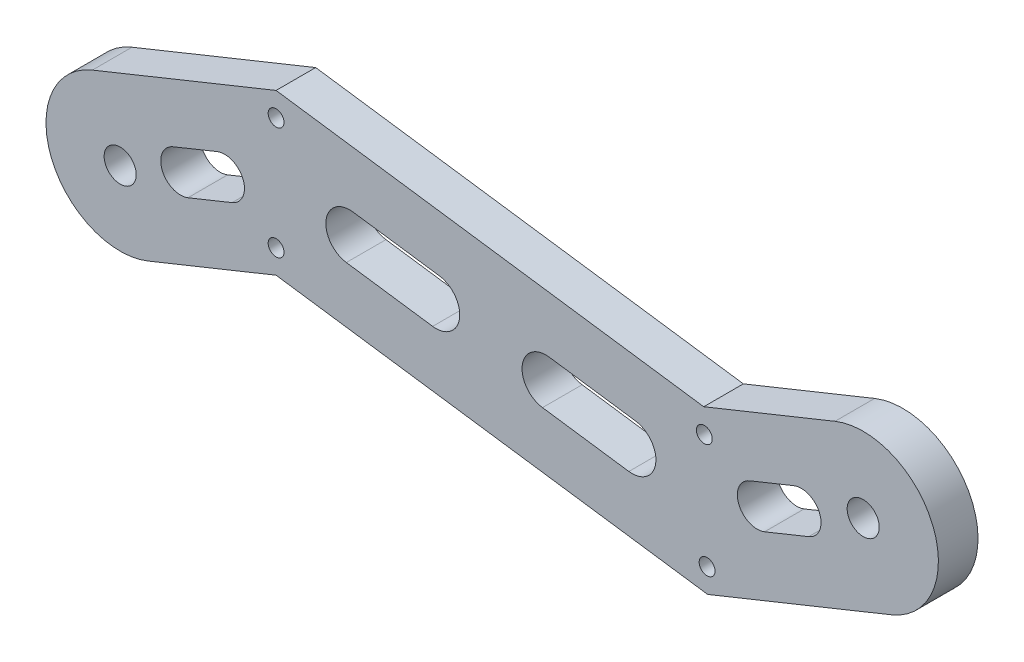
ISO-10303-21;
HEADER;
FILE_DESCRIPTION(('STEP AP214'),'2;1');
FILE_NAME('part.step','',(''),(''),'','','');
FILE_SCHEMA(('AUTOMOTIVE_DESIGN { 1 0 10303 214 1 1 1 1 }'));
ENDSEC;
DATA;
#1=APPLICATION_CONTEXT('core data for automotive mechanical design processes');
#2=APPLICATION_PROTOCOL_DEFINITION('international standard','automotive_design',2000,#1);
#3=PRODUCT_CONTEXT('',#1,'mechanical');
#4=PRODUCT('Part','Part','',(#3));
#5=PRODUCT_RELATED_PRODUCT_CATEGORY('part','',(#4));
#6=PRODUCT_DEFINITION_FORMATION('','',#4);
#7=PRODUCT_DEFINITION_CONTEXT('part definition',#1,'design');
#8=PRODUCT_DEFINITION('design','',#6,#7);
#9=PRODUCT_DEFINITION_SHAPE('','',#8);
#10=(LENGTH_UNIT() NAMED_UNIT(*) SI_UNIT(.MILLI.,.METRE.));
#11=(NAMED_UNIT(*) PLANE_ANGLE_UNIT() SI_UNIT($,.RADIAN.));
#12=(NAMED_UNIT(*) SI_UNIT($,.STERADIAN.) SOLID_ANGLE_UNIT());
#13=UNCERTAINTY_MEASURE_WITH_UNIT(LENGTH_MEASURE(1.E-05),#10,'distance_accuracy_value','');
#14=(GEOMETRIC_REPRESENTATION_CONTEXT(3) GLOBAL_UNCERTAINTY_ASSIGNED_CONTEXT((#13)) GLOBAL_UNIT_ASSIGNED_CONTEXT((#10,
#11,#12)) REPRESENTATION_CONTEXT('',''));
#15=CARTESIAN_POINT('',(0.,0.,0.));
#16=DIRECTION('',(0.,0.,1.));
#17=DIRECTION('',(1.,0.,0.));
#18=AXIS2_PLACEMENT_3D('',#15,#16,#17);
#19=CARTESIAN_POINT('',(-91.8699436205663,2.980916678925,10.));
#20=DIRECTION('',(0.,0.,1.));
#21=DIRECTION('',(1.,0.,0.));
#22=AXIS2_PLACEMENT_3D('',#19,#20,#21);
#23=PLANE('',#22);
#24=DIRECTION('',(0.927183854566787,0.374606593415913,0.));
#25=VECTOR('',#24,1.);
#26=CARTESIAN_POINT('',(70.7597122956534,4.2465525505887,10.));
#27=LINE('',#26,#25);
#28=CARTESIAN_POINT('',(70.7597122956534,4.2465525505887,10.));
#29=VERTEX_POINT('',#28);
#30=CARTESIAN_POINT('',(81.8859185504549,8.74183167157967,10.));
#31=VERTEX_POINT('',#30);
#32=EDGE_CURVE('E269',#29,#31,#27,.T.);
#33=ORIENTED_EDGE('',*,*,#32,.F.);
#34=CARTESIAN_POINT('',(68.8866793285738,8.88247182342264,10.));
#35=DIRECTION('',(0.,0.,1.));
#36=DIRECTION('',(1.,0.,0.));
#37=AXIS2_PLACEMENT_3D('',#34,#35,#36);
#38=CIRCLE('',#37,5.);
#39=CARTESIAN_POINT('',(67.0136463614943,13.5183910962566,10.));
#40=VERTEX_POINT('',#39);
#41=EDGE_CURVE('E267',#40,#29,#38,.T.);
#42=ORIENTED_EDGE('',*,*,#41,.F.);
#43=DIRECTION('',(-0.927183854566787,-0.374606593415913,0.));
#44=VECTOR('',#43,1.);
#45=CARTESIAN_POINT('',(67.0136463614943,13.5183910962566,10.));
#46=LINE('',#45,#44);
#47=CARTESIAN_POINT('',(78.1398526162957,18.0136702172475,10.));
#48=VERTEX_POINT('',#47);
#49=EDGE_CURVE('E275',#48,#40,#46,.T.);
#50=ORIENTED_EDGE('',*,*,#49,.F.);
#51=CARTESIAN_POINT('',(80.0128855833753,13.3777509444136,10.));
#52=DIRECTION('',(0.,0.,1.));
#53=DIRECTION('',(1.,0.,0.));
#54=AXIS2_PLACEMENT_3D('',#51,#52,#53);
#55=CIRCLE('',#54,5.);
#56=EDGE_CURVE('E272',#31,#48,#55,.T.);
#57=ORIENTED_EDGE('',*,*,#56,.F.);
#58=EDGE_LOOP('',(#33,#42,#50,#57));
#59=FACE_BOUND('',#58,.T.);
#60=DIRECTION('',(0.927183854566787,0.374606593415913,0.));
#61=VECTOR('',#60,1.);
#62=CARTESIAN_POINT('',(-74.7593499035873,4.50137156680685,10.));
#63=LINE('',#62,#61);
#64=CARTESIAN_POINT('',(-74.7593499035873,4.50137156680685,10.));
#65=VERTEX_POINT('',#64);
#66=CARTESIAN_POINT('',(-63.6331436487858,8.99665068779783,10.));
#67=VERTEX_POINT('',#66);
#68=EDGE_CURVE('E300',#65,#67,#63,.T.);
#69=ORIENTED_EDGE('',*,*,#68,.F.);
#70=CARTESIAN_POINT('',(-76.6323828706669,9.1372908396408,10.));
#71=DIRECTION('',(0.,0.,1.));
#72=DIRECTION('',(1.,0.,0.));
#73=AXIS2_PLACEMENT_3D('',#70,#71,#72);
#74=CIRCLE('',#73,5.);
#75=CARTESIAN_POINT('',(-78.5054158377464,13.7732101124747,10.));
#76=VERTEX_POINT('',#75);
#77=EDGE_CURVE('E298',#76,#65,#74,.T.);
#78=ORIENTED_EDGE('',*,*,#77,.F.);
#79=DIRECTION('',(-0.927183854566787,-0.374606593415913,0.));
#80=VECTOR('',#79,1.);
#81=CARTESIAN_POINT('',(-78.5054158377464,13.7732101124747,10.));
#82=LINE('',#81,#80);
#83=CARTESIAN_POINT('',(-67.379209582945,18.2684892334657,10.));
#84=VERTEX_POINT('',#83);
#85=EDGE_CURVE('E306',#84,#76,#82,.T.);
#86=ORIENTED_EDGE('',*,*,#85,.F.);
#87=CARTESIAN_POINT('',(-65.5061766158654,13.6325699606318,10.));
#88=DIRECTION('',(0.,0.,1.));
#89=DIRECTION('',(1.,0.,0.));
#90=AXIS2_PLACEMENT_3D('',#87,#88,#89);
#91=CIRCLE('',#90,5.);
#92=EDGE_CURVE('E303',#67,#84,#91,.T.);
#93=ORIENTED_EDGE('',*,*,#92,.F.);
#94=EDGE_LOOP('',(#69,#78,#86,#93));
#95=FACE_BOUND('',#94,.T.);
#96=CARTESIAN_POINT('',(-52.5256026519304,4.68051081808217,10.));
#97=DIRECTION('',(0.,0.,1.));
#98=DIRECTION('',(1.,0.,0.));
#99=AXIS2_PLACEMENT_3D('',#96,#97,#98);
#100=CIRCLE('',#99,2.);
#101=CARTESIAN_POINT('',(-50.5256026519304,4.68051081808217,10.));
#102=VERTEX_POINT('',#101);
#103=EDGE_CURVE('E329',#102,#102,#100,.T.);
#104=ORIENTED_EDGE('',*,*,#103,.F.);
#105=EDGE_LOOP('',(#104));
#106=FACE_BOUND('',#105,.T.);
#107=CARTESIAN_POINT('',(-52.5256026519304,33.0736137188269,10.));
#108=DIRECTION('',(0.,0.,1.));
#109=DIRECTION('',(1.,0.,0.));
#110=AXIS2_PLACEMENT_3D('',#107,#108,#109);
#111=CIRCLE('',#110,2.);
#112=CARTESIAN_POINT('',(-50.5256026519304,33.0736137188269,10.));
#113=VERTEX_POINT('',#112);
#114=EDGE_CURVE('E341',#113,#113,#111,.T.);
#115=ORIENTED_EDGE('',*,*,#114,.F.);
#116=EDGE_LOOP('',(#115));
#117=FACE_BOUND('',#116,.T.);
#118=CARTESIAN_POINT('',(-91.8699436205663,2.980916678925,10.));
#119=DIRECTION('',(0.,0.,1.));
#120=DIRECTION('',(1.,0.,0.));
#121=AXIS2_PLACEMENT_3D('',#118,#119,#120);
#122=CIRCLE('',#121,4.05);
#123=CARTESIAN_POINT('',(-87.8199436205663,2.980916678925,10.));
#124=VERTEX_POINT('',#123);
#125=EDGE_CURVE('E353',#124,#124,#122,.T.);
#126=ORIENTED_EDGE('',*,*,#125,.F.);
#127=EDGE_LOOP('',(#126));
#128=FACE_BOUND('',#127,.T.);
#129=DIRECTION('',(-0.927183854566787,-0.374606593415913,0.));
#130=VECTOR('',#129,1.);
#131=CARTESIAN_POINT('',(-52.5256026519304,39.0736137188269,10.));
#132=LINE('',#131,#130);
#133=CARTESIAN_POINT('',(-52.5256026519304,39.0736137188269,10.));
#134=VERTEX_POINT('',#133);
#135=CARTESIAN_POINT('',(-98.8847953802698,20.3432840480312,10.));
#136=VERTEX_POINT('',#135);
#137=EDGE_CURVE('E359',#134,#136,#132,.T.);
#138=ORIENTED_EDGE('',*,*,#137,.T.);
#139=CARTESIAN_POINT('',(-91.8699436205663,2.980916678925,10.));
#140=DIRECTION('',(0.,0.,1.));
#141=DIRECTION('',(1.,0.,0.));
#142=AXIS2_PLACEMENT_3D('',#139,#140,#141);
#143=CIRCLE('',#142,18.7259164227127);
#144=CARTESIAN_POINT('',(-84.8550918608627,-14.3814506901812,10.));
#145=VERTEX_POINT('',#144);
#146=EDGE_CURVE('E362',#136,#145,#143,.T.);
#147=ORIENTED_EDGE('',*,*,#146,.T.);
#148=DIRECTION('',(0.927183854566787,0.374606593415913,0.));
#149=VECTOR('',#148,1.);
#150=CARTESIAN_POINT('',(-52.5256026519304,-1.31948918191783,10.));
#151=LINE('',#150,#149);
#152=CARTESIAN_POINT('',(-52.5256026519304,-1.31948918191783,10.));
#153=VERTEX_POINT('',#152);
#154=EDGE_CURVE('E365',#145,#153,#151,.T.);
#155=ORIENTED_EDGE('',*,*,#154,.T.);
#156=DIRECTION('',(0.99026806874157,-0.139173100960066,0.));
#157=VECTOR('',#156,1.);
#158=CARTESIAN_POINT('',(-52.5256026519304,-1.31948918191783,10.));
#159=LINE('',#158,#157);
#160=CARTESIAN_POINT('',(56.4038849096423,-16.6285302875251,10.));
#161=VERTEX_POINT('',#160);
#162=EDGE_CURVE('E367',#153,#161,#159,.T.);
#163=ORIENTED_EDGE('',*,*,#162,.T.);
#164=DIRECTION('',(0.927183854566787,0.374606593415913,0.));
#165=VECTOR('',#164,1.);
#166=CARTESIAN_POINT('',(56.4038849096423,-16.6285302875251,10.));
#167=LINE('',#166,#165);
#168=CARTESIAN_POINT('',(102.763077637982,2.10179938327057,10.));
#169=VERTEX_POINT('',#168);
#170=EDGE_CURVE('E369',#161,#169,#167,.T.);
#171=ORIENTED_EDGE('',*,*,#170,.T.);
#172=CARTESIAN_POINT('',(95.6540738473726,19.6972012062936,10.));
#173=DIRECTION('',(0.,0.,1.));
#174=DIRECTION('',(-1.,0.,0.));
#175=AXIS2_PLACEMENT_3D('',#172,#173,#174);
#176=CIRCLE('',#175,18.9772521775028);
#177=CARTESIAN_POINT('',(88.5450700567636,37.2926030293166,10.));
#178=VERTEX_POINT('',#177);
#179=EDGE_CURVE('E371',#169,#178,#176,.T.);
#180=ORIENTED_EDGE('',*,*,#179,.T.);
#181=DIRECTION('',(-0.927183854566787,-0.374606593415913,0.));
#182=VECTOR('',#181,1.);
#183=CARTESIAN_POINT('',(55.4083258196354,23.9044893187248,10.));
#184=LINE('',#183,#182);
#185=CARTESIAN_POINT('',(55.4083258196354,23.9044893187248,10.));
#186=VERTEX_POINT('',#185);
#187=EDGE_CURVE('E373',#178,#186,#184,.T.);
#188=ORIENTED_EDGE('',*,*,#187,.T.);
#189=DIRECTION('',(-0.99026806874157,0.139173100960066,0.));
#190=VECTOR('',#189,1.);
#191=CARTESIAN_POINT('',(-52.5256026519304,39.0736137188269,10.));
#192=LINE('',#191,#190);
#193=EDGE_CURVE('E375',#186,#134,#192,.T.);
#194=ORIENTED_EDGE('',*,*,#193,.T.);
#195=EDGE_LOOP('',(#138,#147,#155,#163,#171,#180,#188,#194));
#196=FACE_BOUND('',#195,.T.);
#197=CARTESIAN_POINT('',(95.6540738473726,19.6972012062936,10.));
#198=DIRECTION('',(0.,0.,1.));
#199=DIRECTION('',(1.,0.,0.));
#200=AXIS2_PLACEMENT_3D('',#197,#198,#199);
#201=CIRCLE('',#200,4.05);
#202=CARTESIAN_POINT('',(99.7040738473727,19.6972012062936,10.));
#203=VERTEX_POINT('',#202);
#204=EDGE_CURVE('E347',#203,#203,#201,.T.);
#205=ORIENTED_EDGE('',*,*,#204,.F.);
#206=EDGE_LOOP('',(#205));
#207=FACE_BOUND('',#206,.T.);
#208=CARTESIAN_POINT('',(55.555695904521,17.9044893187248,10.));
#209=DIRECTION('',(0.,0.,1.));
#210=DIRECTION('',(1.,0.,0.));
#211=AXIS2_PLACEMENT_3D('',#208,#209,#210);
#212=CIRCLE('',#211,2.);
#213=CARTESIAN_POINT('',(57.555695904521,17.9044893187248,10.));
#214=VERTEX_POINT('',#213);
#215=EDGE_CURVE('E335',#214,#214,#212,.T.);
#216=ORIENTED_EDGE('',*,*,#215,.F.);
#217=EDGE_LOOP('',(#216));
#218=FACE_BOUND('',#217,.T.);
#219=CARTESIAN_POINT('',(56.2565148247568,-10.6285302875251,10.));
#220=DIRECTION('',(0.,0.,1.));
#221=DIRECTION('',(1.,0.,0.));
#222=AXIS2_PLACEMENT_3D('',#219,#220,#221);
#223=CIRCLE('',#222,2.);
#224=CARTESIAN_POINT('',(58.2565148247568,-10.6285302875251,10.));
#225=VERTEX_POINT('',#224);
#226=EDGE_CURVE('E261',#225,#225,#223,.T.);
#227=ORIENTED_EDGE('',*,*,#226,.F.);
#228=EDGE_LOOP('',(#227));
#229=FACE_BOUND('',#228,.T.);
#230=DIRECTION('',(0.99026806874157,-0.139173100960066,0.));
#231=VECTOR('',#230,1.);
#232=CARTESIAN_POINT('',(-34.7944377241027,10.3261441141401,10.));
#233=LINE('',#232,#231);
#234=CARTESIAN_POINT('',(-34.7944377241027,10.3261441141401,10.));
#235=VERTEX_POINT('',#234);
#236=CARTESIAN_POINT('',(-13.0085402117882,7.2643358930187,10.));
#237=VERTEX_POINT('',#236);
#238=EDGE_CURVE('E232',#235,#237,#233,.T.);
#239=ORIENTED_EDGE('',*,*,#238,.F.);
#240=CARTESIAN_POINT('',(-33.9593991183423,16.2677525265896,10.));
#241=DIRECTION('',(0.,0.,1.));
#242=DIRECTION('',(1.,0.,0.));
#243=AXIS2_PLACEMENT_3D('',#240,#241,#242);
#244=CIRCLE('',#243,6.);
#245=CARTESIAN_POINT('',(-33.1243605125819,22.209360939039,10.));
#246=VERTEX_POINT('',#245);
#247=EDGE_CURVE('E230',#246,#235,#244,.T.);
#248=ORIENTED_EDGE('',*,*,#247,.F.);
#249=DIRECTION('',(-0.99026806874157,0.139173100960065,0.));
#250=VECTOR('',#249,1.);
#251=CARTESIAN_POINT('',(-33.1243605125819,22.209360939039,10.));
#252=LINE('',#251,#250);
#253=CARTESIAN_POINT('',(-11.3384630002674,19.1475527179175,10.));
#254=VERTEX_POINT('',#253);
#255=EDGE_CURVE('E238',#254,#246,#252,.T.);
#256=ORIENTED_EDGE('',*,*,#255,.F.);
#257=CARTESIAN_POINT('',(-12.1735016060278,13.2059443054681,10.));
#258=DIRECTION('',(0.,0.,1.));
#259=DIRECTION('',(1.,0.,0.));
#260=AXIS2_PLACEMENT_3D('',#257,#258,#259);
#261=CIRCLE('',#260,6.);
#262=EDGE_CURVE('E235',#237,#254,#261,.T.);
#263=ORIENTED_EDGE('',*,*,#262,.F.);
#264=EDGE_LOOP('',(#239,#248,#256,#263));
#265=FACE_BOUND('',#264,.T.);
#266=DIRECTION('',(0.99026806874157,-0.139173100960066,0.));
#267=VECTOR('',#266,1.);
#268=CARTESIAN_POINT('',(14.7189657129758,3.36748906613686,10.));
#269=LINE('',#268,#267);
#270=CARTESIAN_POINT('',(14.7189657129758,3.36748906613686,10.));
#271=VERTEX_POINT('',#270);
#272=CARTESIAN_POINT('',(36.5048632252904,0.305680845015419,10.));
#273=VERTEX_POINT('',#272);
#274=EDGE_CURVE('E202',#271,#273,#269,.T.);
#275=ORIENTED_EDGE('',*,*,#274,.F.);
#276=CARTESIAN_POINT('',(15.5540043187362,9.30909747858628,10.));
#277=DIRECTION('',(0.,0.,1.));
#278=DIRECTION('',(1.,0.,0.));
#279=AXIS2_PLACEMENT_3D('',#276,#277,#278);
#280=CIRCLE('',#279,6.);
#281=CARTESIAN_POINT('',(16.3890429244966,15.2507058910357,10.));
#282=VERTEX_POINT('',#281);
#283=EDGE_CURVE('E194',#282,#271,#280,.T.);
#284=ORIENTED_EDGE('',*,*,#283,.F.);
#285=DIRECTION('',(-0.99026806874157,0.139173100960066,0.));
#286=VECTOR('',#285,1.);
#287=CARTESIAN_POINT('',(16.3890429244966,15.2507058910357,10.));
#288=LINE('',#287,#286);
#289=CARTESIAN_POINT('',(38.1749404368111,12.1888976699143,10.));
#290=VERTEX_POINT('',#289);
#291=EDGE_CURVE('E216',#290,#282,#288,.T.);
#292=ORIENTED_EDGE('',*,*,#291,.F.);
#293=CARTESIAN_POINT('',(37.3399018310508,6.24728925746484,10.));
#294=DIRECTION('',(0.,0.,1.));
#295=DIRECTION('',(1.,0.,0.));
#296=AXIS2_PLACEMENT_3D('',#293,#294,#295);
#297=CIRCLE('',#296,6.);
#298=EDGE_CURVE('E214',#273,#290,#297,.T.);
#299=ORIENTED_EDGE('',*,*,#298,.F.);
#300=EDGE_LOOP('',(#275,#284,#292,#299));
#301=FACE_BOUND('',#300,.T.);
#302=ADVANCED_FACE('F33',(#59,#95,#106,#117,#128,#196,#207,#218,#229,#265,#301),#23,.T.);
#303=CARTESIAN_POINT('',(-91.8699436205663,2.980916678925,0.));
#304=DIRECTION('',(0.,0.,1.));
#305=DIRECTION('',(1.,0.,0.));
#306=AXIS2_PLACEMENT_3D('',#303,#304,#305);
#307=PLANE('',#306);
#308=CARTESIAN_POINT('',(-33.9593991183423,16.2677525265896,0.));
#309=DIRECTION('',(0.,0.,1.));
#310=DIRECTION('',(1.,0.,0.));
#311=AXIS2_PLACEMENT_3D('',#308,#309,#310);
#312=CIRCLE('',#311,6.);
#313=CARTESIAN_POINT('',(-33.1243605125819,22.209360939039,0.));
#314=VERTEX_POINT('',#313);
#315=CARTESIAN_POINT('',(-34.7944377241027,10.3261441141401,0.));
#316=VERTEX_POINT('',#315);
#317=EDGE_CURVE('E210',#314,#316,#312,.T.);
#318=ORIENTED_EDGE('',*,*,#317,.T.);
#319=DIRECTION('',(0.99026806874157,-0.139173100960066,0.));
#320=VECTOR('',#319,1.);
#321=CARTESIAN_POINT('',(-34.7944377241027,10.3261441141401,0.));
#322=LINE('',#321,#320);
#323=CARTESIAN_POINT('',(-13.0085402117882,7.2643358930187,0.));
#324=VERTEX_POINT('',#323);
#325=EDGE_CURVE('E243',#316,#324,#322,.T.);
#326=ORIENTED_EDGE('',*,*,#325,.T.);
#327=CARTESIAN_POINT('',(-12.1735016060278,13.2059443054681,0.));
#328=DIRECTION('',(0.,0.,1.));
#329=DIRECTION('',(1.,0.,0.));
#330=AXIS2_PLACEMENT_3D('',#327,#328,#329);
#331=CIRCLE('',#330,6.);
#332=CARTESIAN_POINT('',(-11.3384630002674,19.1475527179175,0.));
#333=VERTEX_POINT('',#332);
#334=EDGE_CURVE('E246',#324,#333,#331,.T.);
#335=ORIENTED_EDGE('',*,*,#334,.T.);
#336=DIRECTION('',(-0.99026806874157,0.139173100960065,0.));
#337=VECTOR('',#336,1.);
#338=CARTESIAN_POINT('',(-33.1243605125819,22.209360939039,0.));
#339=LINE('',#338,#337);
#340=EDGE_CURVE('E233',#333,#314,#339,.T.);
#341=ORIENTED_EDGE('',*,*,#340,.T.);
#342=EDGE_LOOP('',(#318,#326,#335,#341));
#343=FACE_BOUND('',#342,.T.);
#344=CARTESIAN_POINT('',(-76.6323828706669,9.1372908396408,0.));
#345=DIRECTION('',(0.,0.,1.));
#346=DIRECTION('',(1.,0.,0.));
#347=AXIS2_PLACEMENT_3D('',#344,#345,#346);
#348=CIRCLE('',#347,5.);
#349=CARTESIAN_POINT('',(-78.5054158377464,13.7732101124747,0.));
#350=VERTEX_POINT('',#349);
#351=CARTESIAN_POINT('',(-74.7593499035873,4.50137156680685,0.));
#352=VERTEX_POINT('',#351);
#353=EDGE_CURVE('E297',#350,#352,#348,.T.);
#354=ORIENTED_EDGE('',*,*,#353,.T.);
#355=DIRECTION('',(0.927183854566787,0.374606593415913,0.));
#356=VECTOR('',#355,1.);
#357=CARTESIAN_POINT('',(-74.7593499035873,4.50137156680685,0.));
#358=LINE('',#357,#356);
#359=CARTESIAN_POINT('',(-63.6331436487858,8.99665068779783,0.));
#360=VERTEX_POINT('',#359);
#361=EDGE_CURVE('E311',#352,#360,#358,.T.);
#362=ORIENTED_EDGE('',*,*,#361,.T.);
#363=CARTESIAN_POINT('',(-65.5061766158654,13.6325699606318,0.));
#364=DIRECTION('',(0.,0.,1.));
#365=DIRECTION('',(1.,0.,0.));
#366=AXIS2_PLACEMENT_3D('',#363,#364,#365);
#367=CIRCLE('',#366,5.);
#368=CARTESIAN_POINT('',(-67.379209582945,18.2684892334657,0.));
#369=VERTEX_POINT('',#368);
#370=EDGE_CURVE('E314',#360,#369,#367,.T.);
#371=ORIENTED_EDGE('',*,*,#370,.T.);
#372=DIRECTION('',(-0.927183854566787,-0.374606593415913,0.));
#373=VECTOR('',#372,1.);
#374=CARTESIAN_POINT('',(-78.5054158377464,13.7732101124747,0.));
#375=LINE('',#374,#373);
#376=EDGE_CURVE('E301',#369,#350,#375,.T.);
#377=ORIENTED_EDGE('',*,*,#376,.T.);
#378=EDGE_LOOP('',(#354,#362,#371,#377));
#379=FACE_BOUND('',#378,.T.);
#380=DIRECTION('',(-0.927183854566787,-0.374606593415913,0.));
#381=VECTOR('',#380,1.);
#382=CARTESIAN_POINT('',(-52.5256026519304,39.0736137188269,0.));
#383=LINE('',#382,#381);
#384=CARTESIAN_POINT('',(-52.5256026519304,39.0736137188269,0.));
#385=VERTEX_POINT('',#384);
#386=CARTESIAN_POINT('',(-98.8847953802698,20.3432840480312,0.));
#387=VERTEX_POINT('',#386);
#388=EDGE_CURVE('E356',#385,#387,#383,.T.);
#389=ORIENTED_EDGE('',*,*,#388,.F.);
#390=DIRECTION('',(-0.99026806874157,0.139173100960066,0.));
#391=VECTOR('',#390,1.);
#392=CARTESIAN_POINT('',(-52.5256026519304,39.0736137188269,0.));
#393=LINE('',#392,#391);
#394=CARTESIAN_POINT('',(55.4083258196354,23.9044893187248,0.));
#395=VERTEX_POINT('',#394);
#396=EDGE_CURVE('E363',#395,#385,#393,.T.);
#397=ORIENTED_EDGE('',*,*,#396,.F.);
#398=DIRECTION('',(-0.927183854566787,-0.374606593415913,0.));
#399=VECTOR('',#398,1.);
#400=CARTESIAN_POINT('',(55.4083258196354,23.9044893187248,0.));
#401=LINE('',#400,#399);
#402=CARTESIAN_POINT('',(88.5450700567636,37.2926030293166,0.));
#403=VERTEX_POINT('',#402);
#404=EDGE_CURVE('E390',#403,#395,#401,.T.);
#405=ORIENTED_EDGE('',*,*,#404,.F.);
#406=CARTESIAN_POINT('',(95.6540738473726,19.6972012062936,0.));
#407=DIRECTION('',(0.,0.,1.));
#408=DIRECTION('',(-1.,0.,0.));
#409=AXIS2_PLACEMENT_3D('',#406,#407,#408);
#410=CIRCLE('',#409,18.9772521775028);
#411=CARTESIAN_POINT('',(102.763077637982,2.10179938327057,0.));
#412=VERTEX_POINT('',#411);
#413=EDGE_CURVE('E388',#412,#403,#410,.T.);
#414=ORIENTED_EDGE('',*,*,#413,.F.);
#415=DIRECTION('',(0.927183854566787,0.374606593415913,0.));
#416=VECTOR('',#415,1.);
#417=CARTESIAN_POINT('',(56.4038849096423,-16.6285302875251,0.));
#418=LINE('',#417,#416);
#419=CARTESIAN_POINT('',(56.4038849096423,-16.6285302875251,0.));
#420=VERTEX_POINT('',#419);
#421=EDGE_CURVE('E386',#420,#412,#418,.T.);
#422=ORIENTED_EDGE('',*,*,#421,.F.);
#423=DIRECTION('',(0.99026806874157,-0.139173100960066,0.));
#424=VECTOR('',#423,1.);
#425=CARTESIAN_POINT('',(-52.5256026519304,-1.31948918191783,0.));
#426=LINE('',#425,#424);
#427=CARTESIAN_POINT('',(-52.5256026519304,-1.31948918191783,0.));
#428=VERTEX_POINT('',#427);
#429=EDGE_CURVE('E384',#428,#420,#426,.T.);
#430=ORIENTED_EDGE('',*,*,#429,.F.);
#431=DIRECTION('',(0.927183854566787,0.374606593415913,0.));
#432=VECTOR('',#431,1.);
#433=CARTESIAN_POINT('',(-52.5256026519304,-1.31948918191783,0.));
#434=LINE('',#433,#432);
#435=CARTESIAN_POINT('',(-84.8550918608627,-14.3814506901812,0.));
#436=VERTEX_POINT('',#435);
#437=EDGE_CURVE('E382',#436,#428,#434,.T.);
#438=ORIENTED_EDGE('',*,*,#437,.F.);
#439=CARTESIAN_POINT('',(-91.8699436205663,2.980916678925,0.));
#440=DIRECTION('',(0.,0.,1.));
#441=DIRECTION('',(1.,0.,0.));
#442=AXIS2_PLACEMENT_3D('',#439,#440,#441);
#443=CIRCLE('',#442,18.7259164227127);
#444=EDGE_CURVE('E380',#387,#436,#443,.T.);
#445=ORIENTED_EDGE('',*,*,#444,.F.);
#446=EDGE_LOOP('',(#389,#397,#405,#414,#422,#430,#438,#445));
#447=FACE_BOUND('',#446,.T.);
#448=CARTESIAN_POINT('',(-91.8699436205663,2.980916678925,0.));
#449=DIRECTION('',(0.,0.,1.));
#450=DIRECTION('',(1.,0.,0.));
#451=AXIS2_PLACEMENT_3D('',#448,#449,#450);
#452=CIRCLE('',#451,4.05);
#453=CARTESIAN_POINT('',(-87.8199436205663,2.980916678925,0.));
#454=VERTEX_POINT('',#453);
#455=EDGE_CURVE('E350',#454,#454,#452,.T.);
#456=ORIENTED_EDGE('',*,*,#455,.T.);
#457=EDGE_LOOP('',(#456));
#458=FACE_BOUND('',#457,.T.);
#459=CARTESIAN_POINT('',(95.6540738473726,19.6972012062936,0.));
#460=DIRECTION('',(0.,0.,1.));
#461=DIRECTION('',(1.,0.,0.));
#462=AXIS2_PLACEMENT_3D('',#459,#460,#461);
#463=CIRCLE('',#462,4.05);
#464=CARTESIAN_POINT('',(99.7040738473727,19.6972012062936,0.));
#465=VERTEX_POINT('',#464);
#466=EDGE_CURVE('E344',#465,#465,#463,.T.);
#467=ORIENTED_EDGE('',*,*,#466,.T.);
#468=EDGE_LOOP('',(#467));
#469=FACE_BOUND('',#468,.T.);
#470=CARTESIAN_POINT('',(-52.5256026519304,33.0736137188269,0.));
#471=DIRECTION('',(0.,0.,1.));
#472=DIRECTION('',(1.,0.,0.));
#473=AXIS2_PLACEMENT_3D('',#470,#471,#472);
#474=CIRCLE('',#473,2.);
#475=CARTESIAN_POINT('',(-50.5256026519304,33.0736137188269,0.));
#476=VERTEX_POINT('',#475);
#477=EDGE_CURVE('E338',#476,#476,#474,.T.);
#478=ORIENTED_EDGE('',*,*,#477,.T.);
#479=EDGE_LOOP('',(#478));
#480=FACE_BOUND('',#479,.T.);
#481=CARTESIAN_POINT('',(55.555695904521,17.9044893187248,0.));
#482=DIRECTION('',(0.,0.,1.));
#483=DIRECTION('',(1.,0.,0.));
#484=AXIS2_PLACEMENT_3D('',#481,#482,#483);
#485=CIRCLE('',#484,2.);
#486=CARTESIAN_POINT('',(57.555695904521,17.9044893187248,0.));
#487=VERTEX_POINT('',#486);
#488=EDGE_CURVE('E332',#487,#487,#485,.T.);
#489=ORIENTED_EDGE('',*,*,#488,.T.);
#490=EDGE_LOOP('',(#489));
#491=FACE_BOUND('',#490,.T.);
#492=CARTESIAN_POINT('',(-52.5256026519304,4.68051081808217,0.));
#493=DIRECTION('',(0.,0.,1.));
#494=DIRECTION('',(1.,0.,0.));
#495=AXIS2_PLACEMENT_3D('',#492,#493,#494);
#496=CIRCLE('',#495,2.);
#497=CARTESIAN_POINT('',(-50.5256026519304,4.68051081808217,0.));
#498=VERTEX_POINT('',#497);
#499=EDGE_CURVE('E328',#498,#498,#496,.T.);
#500=ORIENTED_EDGE('',*,*,#499,.T.);
#501=EDGE_LOOP('',(#500));
#502=FACE_BOUND('',#501,.T.);
#503=CARTESIAN_POINT('',(68.8866793285738,8.88247182342264,0.));
#504=DIRECTION('',(0.,0.,1.));
#505=DIRECTION('',(1.,0.,0.));
#506=AXIS2_PLACEMENT_3D('',#503,#504,#505);
#507=CIRCLE('',#506,5.);
#508=CARTESIAN_POINT('',(67.0136463614943,13.5183910962566,0.));
#509=VERTEX_POINT('',#508);
#510=CARTESIAN_POINT('',(70.7597122956534,4.2465525505887,0.));
#511=VERTEX_POINT('',#510);
#512=EDGE_CURVE('E264',#509,#511,#507,.T.);
#513=ORIENTED_EDGE('',*,*,#512,.T.);
#514=DIRECTION('',(0.927183854566787,0.374606593415913,0.));
#515=VECTOR('',#514,1.);
#516=CARTESIAN_POINT('',(70.7597122956534,4.2465525505887,0.));
#517=LINE('',#516,#515);
#518=CARTESIAN_POINT('',(81.8859185504549,8.74183167157967,0.));
#519=VERTEX_POINT('',#518);
#520=EDGE_CURVE('E280',#511,#519,#517,.T.);
#521=ORIENTED_EDGE('',*,*,#520,.T.);
#522=CARTESIAN_POINT('',(80.0128855833753,13.3777509444136,0.));
#523=DIRECTION('',(0.,0.,1.));
#524=DIRECTION('',(1.,0.,0.));
#525=AXIS2_PLACEMENT_3D('',#522,#523,#524);
#526=CIRCLE('',#525,5.);
#527=CARTESIAN_POINT('',(78.1398526162958,18.0136702172475,0.));
#528=VERTEX_POINT('',#527);
#529=EDGE_CURVE('E283',#519,#528,#526,.T.);
#530=ORIENTED_EDGE('',*,*,#529,.T.);
#531=DIRECTION('',(-0.927183854566787,-0.374606593415913,0.));
#532=VECTOR('',#531,1.);
#533=CARTESIAN_POINT('',(67.0136463614943,13.5183910962566,0.));
#534=LINE('',#533,#532);
#535=EDGE_CURVE('E270',#528,#509,#534,.T.);
#536=ORIENTED_EDGE('',*,*,#535,.T.);
#537=EDGE_LOOP('',(#513,#521,#530,#536));
#538=FACE_BOUND('',#537,.T.);
#539=CARTESIAN_POINT('',(56.2565148247568,-10.6285302875251,0.));
#540=DIRECTION('',(0.,0.,1.));
#541=DIRECTION('',(1.,0.,0.));
#542=AXIS2_PLACEMENT_3D('',#539,#540,#541);
#543=CIRCLE('',#542,2.);
#544=CARTESIAN_POINT('',(58.2565148247568,-10.6285302875251,0.));
#545=VERTEX_POINT('',#544);
#546=EDGE_CURVE('E260',#545,#545,#543,.T.);
#547=ORIENTED_EDGE('',*,*,#546,.T.);
#548=EDGE_LOOP('',(#547));
#549=FACE_BOUND('',#548,.T.);
#550=CARTESIAN_POINT('',(15.5540043187362,9.30909747858628,0.));
#551=DIRECTION('',(0.,0.,1.));
#552=DIRECTION('',(1.,0.,0.));
#553=AXIS2_PLACEMENT_3D('',#550,#551,#552);
#554=CIRCLE('',#553,6.);
#555=CARTESIAN_POINT('',(16.3890429244966,15.2507058910357,0.));
#556=VERTEX_POINT('',#555);
#557=CARTESIAN_POINT('',(14.7189657129758,3.36748906613686,0.));
#558=VERTEX_POINT('',#557);
#559=EDGE_CURVE('E56',#556,#558,#554,.T.);
#560=ORIENTED_EDGE('',*,*,#559,.T.);
#561=DIRECTION('',(0.99026806874157,-0.139173100960066,0.));
#562=VECTOR('',#561,1.);
#563=CARTESIAN_POINT('',(14.7189657129758,3.36748906613686,0.));
#564=LINE('',#563,#562);
#565=CARTESIAN_POINT('',(36.5048632252904,0.305680845015419,0.));
#566=VERTEX_POINT('',#565);
#567=EDGE_CURVE('E209',#558,#566,#564,.T.);
#568=ORIENTED_EDGE('',*,*,#567,.T.);
#569=CARTESIAN_POINT('',(37.3399018310508,6.24728925746484,0.));
#570=DIRECTION('',(0.,0.,1.));
#571=DIRECTION('',(1.,0.,0.));
#572=AXIS2_PLACEMENT_3D('',#569,#570,#571);
#573=CIRCLE('',#572,6.);
#574=CARTESIAN_POINT('',(38.1749404368111,12.1888976699143,0.));
#575=VERTEX_POINT('',#574);
#576=EDGE_CURVE('E222',#566,#575,#573,.T.);
#577=ORIENTED_EDGE('',*,*,#576,.T.);
#578=DIRECTION('',(-0.99026806874157,0.139173100960066,0.));
#579=VECTOR('',#578,1.);
#580=CARTESIAN_POINT('',(16.3890429244966,15.2507058910357,0.));
#581=LINE('',#580,#579);
#582=EDGE_CURVE('E203',#575,#556,#581,.T.);
#583=ORIENTED_EDGE('',*,*,#582,.T.);
#584=EDGE_LOOP('',(#560,#568,#577,#583));
#585=FACE_BOUND('',#584,.T.);
#586=ADVANCED_FACE('F420',(#343,#379,#447,#458,#469,#480,#491,#502,#538,#549,#585),#307,.F.);
#587=CARTESIAN_POINT('',(-52.5256026519304,39.0736137188269,10.));
#588=DIRECTION('',(0.374606593415913,-0.927183854566787,0.));
#589=DIRECTION('',(0.927183854566787,0.374606593415913,0.));
#590=AXIS2_PLACEMENT_3D('',#587,#588,#589);
#591=PLANE('',#590);
#592=ORIENTED_EDGE('',*,*,#388,.T.);
#593=DIRECTION('',(0.,0.,-1.));
#594=VECTOR('',#593,1.);
#595=CARTESIAN_POINT('',(-98.8847953802698,20.3432840480312,10.));
#596=LINE('',#595,#594);
#597=EDGE_CURVE('E11',#136,#387,#596,.T.);
#598=ORIENTED_EDGE('',*,*,#597,.F.);
#599=ORIENTED_EDGE('',*,*,#137,.F.);
#600=DIRECTION('',(0.,0.,-1.));
#601=VECTOR('',#600,1.);
#602=CARTESIAN_POINT('',(-52.5256026519304,39.0736137188269,10.));
#603=LINE('',#602,#601);
#604=EDGE_CURVE('E377',#134,#385,#603,.T.);
#605=ORIENTED_EDGE('',*,*,#604,.T.);
#606=EDGE_LOOP('',(#592,#598,#599,#605));
#607=FACE_BOUND('',#606,.T.);
#608=ADVANCED_FACE('F35',(#607),#591,.F.);
#609=CARTESIAN_POINT('',(-91.8699436205663,2.980916678925,10.));
#610=DIRECTION('',(0.,0.,-1.));
#611=DIRECTION('',(-1.,0.,0.));
#612=AXIS2_PLACEMENT_3D('',#609,#610,#611);
#613=CYLINDRICAL_SURFACE('',#612,18.7259164227127);
#614=ORIENTED_EDGE('',*,*,#444,.T.);
#615=DIRECTION('',(0.,0.,-1.));
#616=VECTOR('',#615,1.);
#617=CARTESIAN_POINT('',(-84.8550918608627,-14.3814506901812,10.));
#618=LINE('',#617,#616);
#619=EDGE_CURVE('E41',#145,#436,#618,.T.);
#620=ORIENTED_EDGE('',*,*,#619,.F.);
#621=ORIENTED_EDGE('',*,*,#146,.F.);
#622=ORIENTED_EDGE('',*,*,#597,.T.);
#623=EDGE_LOOP('',(#614,#620,#621,#622));
#624=FACE_BOUND('',#623,.T.);
#625=ADVANCED_FACE('F438',(#624),#613,.T.);
#626=CARTESIAN_POINT('',(-52.5256026519304,-1.31948918191783,10.));
#627=DIRECTION('',(-0.374606593415913,0.927183854566787,0.));
#628=DIRECTION('',(-0.927183854566787,-0.374606593415913,0.));
#629=AXIS2_PLACEMENT_3D('',#626,#627,#628);
#630=PLANE('',#629);
#631=ORIENTED_EDGE('',*,*,#437,.T.);
#632=DIRECTION('',(0.,0.,-1.));
#633=VECTOR('',#632,1.);
#634=CARTESIAN_POINT('',(-52.5256026519304,-1.31948918191783,10.));
#635=LINE('',#634,#633);
#636=EDGE_CURVE('E407',#153,#428,#635,.T.);
#637=ORIENTED_EDGE('',*,*,#636,.F.);
#638=ORIENTED_EDGE('',*,*,#154,.F.);
#639=ORIENTED_EDGE('',*,*,#619,.T.);
#640=EDGE_LOOP('',(#631,#637,#638,#639));
#641=FACE_BOUND('',#640,.T.);
#642=ADVANCED_FACE('F414',(#641),#630,.F.);
#643=CARTESIAN_POINT('',(-52.5256026519304,-1.31948918191783,10.));
#644=DIRECTION('',(0.139173100960066,0.99026806874157,0.));
#645=DIRECTION('',(-0.99026806874157,0.139173100960066,0.));
#646=AXIS2_PLACEMENT_3D('',#643,#644,#645);
#647=PLANE('',#646);
#648=ORIENTED_EDGE('',*,*,#429,.T.);
#649=DIRECTION('',(0.,0.,-1.));
#650=VECTOR('',#649,1.);
#651=CARTESIAN_POINT('',(56.4038849096423,-16.6285302875251,10.));
#652=LINE('',#651,#650);
#653=EDGE_CURVE('E404',#161,#420,#652,.T.);
#654=ORIENTED_EDGE('',*,*,#653,.F.);
#655=ORIENTED_EDGE('',*,*,#162,.F.);
#656=ORIENTED_EDGE('',*,*,#636,.T.);
#657=EDGE_LOOP('',(#648,#654,#655,#656));
#658=FACE_BOUND('',#657,.T.);
#659=ADVANCED_FACE('F426',(#658),#647,.F.);
#660=CARTESIAN_POINT('',(56.4038849096423,-16.6285302875251,10.));
#661=DIRECTION('',(-0.374606593415913,0.927183854566787,0.));
#662=DIRECTION('',(-0.927183854566787,-0.374606593415913,0.));
#663=AXIS2_PLACEMENT_3D('',#660,#661,#662);
#664=PLANE('',#663);
#665=ORIENTED_EDGE('',*,*,#421,.T.);
#666=DIRECTION('',(0.,0.,-1.));
#667=VECTOR('',#666,1.);
#668=CARTESIAN_POINT('',(102.763077637982,2.10179938327057,10.));
#669=LINE('',#668,#667);
#670=EDGE_CURVE('E401',#169,#412,#669,.T.);
#671=ORIENTED_EDGE('',*,*,#670,.F.);
#672=ORIENTED_EDGE('',*,*,#170,.F.);
#673=ORIENTED_EDGE('',*,*,#653,.T.);
#674=EDGE_LOOP('',(#665,#671,#672,#673));
#675=FACE_BOUND('',#674,.T.);
#676=ADVANCED_FACE('F430',(#675),#664,.F.);
#677=CARTESIAN_POINT('',(95.6540738473726,19.6972012062936,10.));
#678=DIRECTION('',(0.,0.,-1.));
#679=DIRECTION('',(-1.,0.,0.));
#680=AXIS2_PLACEMENT_3D('',#677,#678,#679);
#681=CYLINDRICAL_SURFACE('',#680,18.9772521775028);
#682=ORIENTED_EDGE('',*,*,#413,.T.);
#683=DIRECTION('',(0.,0.,-1.));
#684=VECTOR('',#683,1.);
#685=CARTESIAN_POINT('',(88.5450700567636,37.2926030293166,10.));
#686=LINE('',#685,#684);
#687=EDGE_CURVE('E398',#178,#403,#686,.T.);
#688=ORIENTED_EDGE('',*,*,#687,.F.);
#689=ORIENTED_EDGE('',*,*,#179,.F.);
#690=ORIENTED_EDGE('',*,*,#670,.T.);
#691=EDGE_LOOP('',(#682,#688,#689,#690));
#692=FACE_BOUND('',#691,.T.);
#693=ADVANCED_FACE('F451',(#692),#681,.T.);
#694=CARTESIAN_POINT('',(55.4083258196354,23.9044893187248,10.));
#695=DIRECTION('',(0.374606593415913,-0.927183854566787,0.));
#696=DIRECTION('',(0.927183854566787,0.374606593415913,0.));
#697=AXIS2_PLACEMENT_3D('',#694,#695,#696);
#698=PLANE('',#697);
#699=ORIENTED_EDGE('',*,*,#404,.T.);
#700=DIRECTION('',(0.,0.,-1.));
#701=VECTOR('',#700,1.);
#702=CARTESIAN_POINT('',(55.4083258196354,23.9044893187248,10.));
#703=LINE('',#702,#701);
#704=EDGE_CURVE('E395',#186,#395,#703,.T.);
#705=ORIENTED_EDGE('',*,*,#704,.F.);
#706=ORIENTED_EDGE('',*,*,#187,.F.);
#707=ORIENTED_EDGE('',*,*,#687,.T.);
#708=EDGE_LOOP('',(#699,#705,#706,#707));
#709=FACE_BOUND('',#708,.T.);
#710=ADVANCED_FACE('F449',(#709),#698,.F.);
#711=CARTESIAN_POINT('',(-52.5256026519304,39.0736137188269,10.));
#712=DIRECTION('',(-0.139173100960066,-0.99026806874157,0.));
#713=DIRECTION('',(0.99026806874157,-0.139173100960066,0.));
#714=AXIS2_PLACEMENT_3D('',#711,#712,#713);
#715=PLANE('',#714);
#716=ORIENTED_EDGE('',*,*,#396,.T.);
#717=ORIENTED_EDGE('',*,*,#604,.F.);
#718=ORIENTED_EDGE('',*,*,#193,.F.);
#719=ORIENTED_EDGE('',*,*,#704,.T.);
#720=EDGE_LOOP('',(#716,#717,#718,#719));
#721=FACE_BOUND('',#720,.T.);
#722=ADVANCED_FACE('F444',(#721),#715,.F.);
#723=CARTESIAN_POINT('',(-91.8699436205663,2.980916678925,10.));
#724=DIRECTION('',(0.,0.,-1.));
#725=DIRECTION('',(-1.,0.,0.));
#726=AXIS2_PLACEMENT_3D('',#723,#724,#725);
#727=CYLINDRICAL_SURFACE('',#726,4.05);
#728=ORIENTED_EDGE('',*,*,#125,.T.);
#729=EDGE_LOOP('',(#728));
#730=FACE_BOUND('',#729,.T.);
#731=ORIENTED_EDGE('',*,*,#455,.F.);
#732=EDGE_LOOP('',(#731));
#733=FACE_BOUND('',#732,.T.);
#734=ADVANCED_FACE('F471',(#730,#733),#727,.F.);
#735=CARTESIAN_POINT('',(95.6540738473726,19.6972012062936,10.));
#736=DIRECTION('',(0.,0.,-1.));
#737=DIRECTION('',(-1.,0.,0.));
#738=AXIS2_PLACEMENT_3D('',#735,#736,#737);
#739=CYLINDRICAL_SURFACE('',#738,4.05);
#740=ORIENTED_EDGE('',*,*,#204,.T.);
#741=EDGE_LOOP('',(#740));
#742=FACE_BOUND('',#741,.T.);
#743=ORIENTED_EDGE('',*,*,#466,.F.);
#744=EDGE_LOOP('',(#743));
#745=FACE_BOUND('',#744,.T.);
#746=ADVANCED_FACE('F478',(#742,#745),#739,.F.);
#747=CARTESIAN_POINT('',(-52.5256026519304,33.0736137188269,10.));
#748=DIRECTION('',(0.,0.,-1.));
#749=DIRECTION('',(-1.,0.,0.));
#750=AXIS2_PLACEMENT_3D('',#747,#748,#749);
#751=CYLINDRICAL_SURFACE('',#750,2.);
#752=ORIENTED_EDGE('',*,*,#114,.T.);
#753=EDGE_LOOP('',(#752));
#754=FACE_BOUND('',#753,.T.);
#755=ORIENTED_EDGE('',*,*,#477,.F.);
#756=EDGE_LOOP('',(#755));
#757=FACE_BOUND('',#756,.T.);
#758=ADVANCED_FACE('F483',(#754,#757),#751,.F.);
#759=CARTESIAN_POINT('',(55.555695904521,17.9044893187248,10.));
#760=DIRECTION('',(0.,0.,-1.));
#761=DIRECTION('',(-1.,0.,0.));
#762=AXIS2_PLACEMENT_3D('',#759,#760,#761);
#763=CYLINDRICAL_SURFACE('',#762,2.);
#764=ORIENTED_EDGE('',*,*,#215,.T.);
#765=EDGE_LOOP('',(#764));
#766=FACE_BOUND('',#765,.T.);
#767=ORIENTED_EDGE('',*,*,#488,.F.);
#768=EDGE_LOOP('',(#767));
#769=FACE_BOUND('',#768,.T.);
#770=ADVANCED_FACE('F570',(#766,#769),#763,.F.);
#771=CARTESIAN_POINT('',(-52.5256026519304,4.68051081808217,10.));
#772=DIRECTION('',(0.,0.,-1.));
#773=DIRECTION('',(-1.,0.,0.));
#774=AXIS2_PLACEMENT_3D('',#771,#772,#773);
#775=CYLINDRICAL_SURFACE('',#774,2.);
#776=ORIENTED_EDGE('',*,*,#103,.T.);
#777=EDGE_LOOP('',(#776));
#778=FACE_BOUND('',#777,.T.);
#779=ORIENTED_EDGE('',*,*,#499,.F.);
#780=EDGE_LOOP('',(#779));
#781=FACE_BOUND('',#780,.T.);
#782=ADVANCED_FACE('F566',(#778,#781),#775,.F.);
#783=CARTESIAN_POINT('',(-76.6323828706669,9.1372908396408,10.));
#784=DIRECTION('',(0.,0.,-1.));
#785=DIRECTION('',(-1.,0.,0.));
#786=AXIS2_PLACEMENT_3D('',#783,#784,#785);
#787=CYLINDRICAL_SURFACE('',#786,5.);
#788=ORIENTED_EDGE('',*,*,#353,.F.);
#789=DIRECTION('',(0.,0.,-1.));
#790=VECTOR('',#789,1.);
#791=CARTESIAN_POINT('',(-78.5054158377464,13.7732101124747,10.));
#792=LINE('',#791,#790);
#793=EDGE_CURVE('E308',#76,#350,#792,.T.);
#794=ORIENTED_EDGE('',*,*,#793,.F.);
#795=ORIENTED_EDGE('',*,*,#77,.T.);
#796=DIRECTION('',(0.,0.,-1.));
#797=VECTOR('',#796,1.);
#798=CARTESIAN_POINT('',(-74.7593499035873,4.50137156680685,10.));
#799=LINE('',#798,#797);
#800=EDGE_CURVE('E325',#65,#352,#799,.T.);
#801=ORIENTED_EDGE('',*,*,#800,.T.);
#802=EDGE_LOOP('',(#788,#794,#795,#801));
#803=FACE_BOUND('',#802,.T.);
#804=ADVANCED_FACE('F562',(#803),#787,.F.);
#805=CARTESIAN_POINT('',(-74.7593499035873,4.50137156680685,10.));
#806=DIRECTION('',(-0.374606593415913,0.927183854566787,0.));
#807=DIRECTION('',(-0.927183854566787,-0.374606593415913,0.));
#808=AXIS2_PLACEMENT_3D('',#805,#806,#807);
#809=PLANE('',#808);
#810=ORIENTED_EDGE('',*,*,#361,.F.);
#811=ORIENTED_EDGE('',*,*,#800,.F.);
#812=ORIENTED_EDGE('',*,*,#68,.T.);
#813=DIRECTION('',(0.,0.,-1.));
#814=VECTOR('',#813,1.);
#815=CARTESIAN_POINT('',(-63.6331436487858,8.99665068779783,10.));
#816=LINE('',#815,#814);
#817=EDGE_CURVE('E323',#67,#360,#816,.T.);
#818=ORIENTED_EDGE('',*,*,#817,.T.);
#819=EDGE_LOOP('',(#810,#811,#812,#818));
#820=FACE_BOUND('',#819,.T.);
#821=ADVANCED_FACE('F558',(#820),#809,.T.);
#822=CARTESIAN_POINT('',(-65.5061766158654,13.6325699606318,10.));
#823=DIRECTION('',(0.,0.,-1.));
#824=DIRECTION('',(-1.,0.,0.));
#825=AXIS2_PLACEMENT_3D('',#822,#823,#824);
#826=CYLINDRICAL_SURFACE('',#825,5.);
#827=ORIENTED_EDGE('',*,*,#370,.F.);
#828=ORIENTED_EDGE('',*,*,#817,.F.);
#829=ORIENTED_EDGE('',*,*,#92,.T.);
#830=DIRECTION('',(0.,0.,-1.));
#831=VECTOR('',#830,1.);
#832=CARTESIAN_POINT('',(-67.379209582945,18.2684892334657,10.));
#833=LINE('',#832,#831);
#834=EDGE_CURVE('E321',#84,#369,#833,.T.);
#835=ORIENTED_EDGE('',*,*,#834,.T.);
#836=EDGE_LOOP('',(#827,#828,#829,#835));
#837=FACE_BOUND('',#836,.T.);
#838=ADVANCED_FACE('F554',(#837),#826,.F.);
#839=CARTESIAN_POINT('',(-78.5054158377464,13.7732101124747,10.));
#840=DIRECTION('',(0.374606593415913,-0.927183854566787,0.));
#841=DIRECTION('',(0.927183854566787,0.374606593415913,0.));
#842=AXIS2_PLACEMENT_3D('',#839,#840,#841);
#843=PLANE('',#842);
#844=ORIENTED_EDGE('',*,*,#376,.F.);
#845=ORIENTED_EDGE('',*,*,#834,.F.);
#846=ORIENTED_EDGE('',*,*,#85,.T.);
#847=ORIENTED_EDGE('',*,*,#793,.T.);
#848=EDGE_LOOP('',(#844,#845,#846,#847));
#849=FACE_BOUND('',#848,.T.);
#850=ADVANCED_FACE('F550',(#849),#843,.T.);
#851=CARTESIAN_POINT('',(68.8866793285738,8.88247182342264,10.));
#852=DIRECTION('',(0.,0.,-1.));
#853=DIRECTION('',(-1.,0.,0.));
#854=AXIS2_PLACEMENT_3D('',#851,#852,#853);
#855=CYLINDRICAL_SURFACE('',#854,5.);
#856=ORIENTED_EDGE('',*,*,#512,.F.);
#857=DIRECTION('',(0.,0.,-1.));
#858=VECTOR('',#857,1.);
#859=CARTESIAN_POINT('',(67.0136463614943,13.5183910962566,10.));
#860=LINE('',#859,#858);
#861=EDGE_CURVE('E277',#40,#509,#860,.T.);
#862=ORIENTED_EDGE('',*,*,#861,.F.);
#863=ORIENTED_EDGE('',*,*,#41,.T.);
#864=DIRECTION('',(0.,0.,-1.));
#865=VECTOR('',#864,1.);
#866=CARTESIAN_POINT('',(70.7597122956534,4.2465525505887,10.));
#867=LINE('',#866,#865);
#868=EDGE_CURVE('E294',#29,#511,#867,.T.);
#869=ORIENTED_EDGE('',*,*,#868,.T.);
#870=EDGE_LOOP('',(#856,#862,#863,#869));
#871=FACE_BOUND('',#870,.T.);
#872=ADVANCED_FACE('F546',(#871),#855,.F.);
#873=CARTESIAN_POINT('',(70.7597122956534,4.2465525505887,10.));
#874=DIRECTION('',(-0.374606593415913,0.927183854566787,0.));
#875=DIRECTION('',(-0.927183854566787,-0.374606593415913,0.));
#876=AXIS2_PLACEMENT_3D('',#873,#874,#875);
#877=PLANE('',#876);
#878=ORIENTED_EDGE('',*,*,#520,.F.);
#879=ORIENTED_EDGE('',*,*,#868,.F.);
#880=ORIENTED_EDGE('',*,*,#32,.T.);
#881=DIRECTION('',(0.,0.,-1.));
#882=VECTOR('',#881,1.);
#883=CARTESIAN_POINT('',(81.8859185504549,8.74183167157967,10.));
#884=LINE('',#883,#882);
#885=EDGE_CURVE('E292',#31,#519,#884,.T.);
#886=ORIENTED_EDGE('',*,*,#885,.T.);
#887=EDGE_LOOP('',(#878,#879,#880,#886));
#888=FACE_BOUND('',#887,.T.);
#889=ADVANCED_FACE('F542',(#888),#877,.T.);
#890=CARTESIAN_POINT('',(80.0128855833753,13.3777509444136,10.));
#891=DIRECTION('',(0.,0.,-1.));
#892=DIRECTION('',(-1.,0.,0.));
#893=AXIS2_PLACEMENT_3D('',#890,#891,#892);
#894=CYLINDRICAL_SURFACE('',#893,5.);
#895=ORIENTED_EDGE('',*,*,#529,.F.);
#896=ORIENTED_EDGE('',*,*,#885,.F.);
#897=ORIENTED_EDGE('',*,*,#56,.T.);
#898=DIRECTION('',(0.,0.,-1.));
#899=VECTOR('',#898,1.);
#900=CARTESIAN_POINT('',(78.1398526162958,18.0136702172475,10.));
#901=LINE('',#900,#899);
#902=EDGE_CURVE('E290',#48,#528,#901,.T.);
#903=ORIENTED_EDGE('',*,*,#902,.T.);
#904=EDGE_LOOP('',(#895,#896,#897,#903));
#905=FACE_BOUND('',#904,.T.);
#906=ADVANCED_FACE('F538',(#905),#894,.F.);
#907=CARTESIAN_POINT('',(67.0136463614943,13.5183910962566,10.));
#908=DIRECTION('',(0.374606593415913,-0.927183854566787,0.));
#909=DIRECTION('',(0.927183854566787,0.374606593415913,0.));
#910=AXIS2_PLACEMENT_3D('',#907,#908,#909);
#911=PLANE('',#910);
#912=ORIENTED_EDGE('',*,*,#535,.F.);
#913=ORIENTED_EDGE('',*,*,#902,.F.);
#914=ORIENTED_EDGE('',*,*,#49,.T.);
#915=ORIENTED_EDGE('',*,*,#861,.T.);
#916=EDGE_LOOP('',(#912,#913,#914,#915));
#917=FACE_BOUND('',#916,.T.);
#918=ADVANCED_FACE('F534',(#917),#911,.T.);
#919=CARTESIAN_POINT('',(56.2565148247568,-10.6285302875251,10.));
#920=DIRECTION('',(0.,0.,-1.));
#921=DIRECTION('',(-1.,0.,0.));
#922=AXIS2_PLACEMENT_3D('',#919,#920,#921);
#923=CYLINDRICAL_SURFACE('',#922,2.);
#924=ORIENTED_EDGE('',*,*,#226,.T.);
#925=EDGE_LOOP('',(#924));
#926=FACE_BOUND('',#925,.T.);
#927=ORIENTED_EDGE('',*,*,#546,.F.);
#928=EDGE_LOOP('',(#927));
#929=FACE_BOUND('',#928,.T.);
#930=ADVANCED_FACE('F530',(#926,#929),#923,.F.);
#931=CARTESIAN_POINT('',(-33.9593991183423,16.2677525265896,10.));
#932=DIRECTION('',(0.,0.,-1.));
#933=DIRECTION('',(-1.,0.,0.));
#934=AXIS2_PLACEMENT_3D('',#931,#932,#933);
#935=CYLINDRICAL_SURFACE('',#934,6.);
#936=ORIENTED_EDGE('',*,*,#317,.F.);
#937=DIRECTION('',(0.,0.,-1.));
#938=VECTOR('',#937,1.);
#939=CARTESIAN_POINT('',(-33.1243605125819,22.209360939039,10.));
#940=LINE('',#939,#938);
#941=EDGE_CURVE('E240',#246,#314,#940,.T.);
#942=ORIENTED_EDGE('',*,*,#941,.F.);
#943=ORIENTED_EDGE('',*,*,#247,.T.);
#944=DIRECTION('',(0.,0.,-1.));
#945=VECTOR('',#944,1.);
#946=CARTESIAN_POINT('',(-34.7944377241027,10.3261441141401,10.));
#947=LINE('',#946,#945);
#948=EDGE_CURVE('E257',#235,#316,#947,.T.);
#949=ORIENTED_EDGE('',*,*,#948,.T.);
#950=EDGE_LOOP('',(#936,#942,#943,#949));
#951=FACE_BOUND('',#950,.T.);
#952=ADVANCED_FACE('F526',(#951),#935,.F.);
#953=CARTESIAN_POINT('',(-34.7944377241027,10.3261441141401,10.));
#954=DIRECTION('',(0.139173100960066,0.99026806874157,0.));
#955=DIRECTION('',(-0.99026806874157,0.139173100960066,0.));
#956=AXIS2_PLACEMENT_3D('',#953,#954,#955);
#957=PLANE('',#956);
#958=ORIENTED_EDGE('',*,*,#325,.F.);
#959=ORIENTED_EDGE('',*,*,#948,.F.);
#960=ORIENTED_EDGE('',*,*,#238,.T.);
#961=DIRECTION('',(0.,0.,-1.));
#962=VECTOR('',#961,1.);
#963=CARTESIAN_POINT('',(-13.0085402117882,7.2643358930187,10.));
#964=LINE('',#963,#962);
#965=EDGE_CURVE('E255',#237,#324,#964,.T.);
#966=ORIENTED_EDGE('',*,*,#965,.T.);
#967=EDGE_LOOP('',(#958,#959,#960,#966));
#968=FACE_BOUND('',#967,.T.);
#969=ADVANCED_FACE('F522',(#968),#957,.T.);
#970=CARTESIAN_POINT('',(-12.1735016060278,13.2059443054681,10.));
#971=DIRECTION('',(0.,0.,-1.));
#972=DIRECTION('',(-1.,0.,0.));
#973=AXIS2_PLACEMENT_3D('',#970,#971,#972);
#974=CYLINDRICAL_SURFACE('',#973,6.);
#975=ORIENTED_EDGE('',*,*,#334,.F.);
#976=ORIENTED_EDGE('',*,*,#965,.F.);
#977=ORIENTED_EDGE('',*,*,#262,.T.);
#978=DIRECTION('',(0.,0.,-1.));
#979=VECTOR('',#978,1.);
#980=CARTESIAN_POINT('',(-11.3384630002674,19.1475527179175,10.));
#981=LINE('',#980,#979);
#982=EDGE_CURVE('E253',#254,#333,#981,.T.);
#983=ORIENTED_EDGE('',*,*,#982,.T.);
#984=EDGE_LOOP('',(#975,#976,#977,#983));
#985=FACE_BOUND('',#984,.T.);
#986=ADVANCED_FACE('F518',(#985),#974,.F.);
#987=CARTESIAN_POINT('',(-33.1243605125819,22.209360939039,10.));
#988=DIRECTION('',(-0.139173100960065,-0.99026806874157,0.));
#989=DIRECTION('',(0.99026806874157,-0.139173100960065,0.));
#990=AXIS2_PLACEMENT_3D('',#987,#988,#989);
#991=PLANE('',#990);
#992=ORIENTED_EDGE('',*,*,#340,.F.);
#993=ORIENTED_EDGE('',*,*,#982,.F.);
#994=ORIENTED_EDGE('',*,*,#255,.T.);
#995=ORIENTED_EDGE('',*,*,#941,.T.);
#996=EDGE_LOOP('',(#992,#993,#994,#995));
#997=FACE_BOUND('',#996,.T.);
#998=ADVANCED_FACE('F515',(#997),#991,.T.);
#999=CARTESIAN_POINT('',(15.5540043187362,9.30909747858628,10.));
#1000=DIRECTION('',(0.,0.,-1.));
#1001=DIRECTION('',(-1.,0.,0.));
#1002=AXIS2_PLACEMENT_3D('',#999,#1000,#1001);
#1003=CYLINDRICAL_SURFACE('',#1002,6.);
#1004=ORIENTED_EDGE('',*,*,#559,.F.);
#1005=DIRECTION('',(0.,0.,-1.));
#1006=VECTOR('',#1005,1.);
#1007=CARTESIAN_POINT('',(16.3890429244966,15.2507058910357,10.));
#1008=LINE('',#1007,#1006);
#1009=EDGE_CURVE('E198',#282,#556,#1008,.T.);
#1010=ORIENTED_EDGE('',*,*,#1009,.F.);
#1011=ORIENTED_EDGE('',*,*,#283,.T.);
#1012=DIRECTION('',(0.,0.,-1.));
#1013=VECTOR('',#1012,1.);
#1014=CARTESIAN_POINT('',(14.7189657129758,3.36748906613686,10.));
#1015=LINE('',#1014,#1013);
#1016=EDGE_CURVE('E197',#271,#558,#1015,.T.);
#1017=ORIENTED_EDGE('',*,*,#1016,.T.);
#1018=EDGE_LOOP('',(#1004,#1010,#1011,#1017));
#1019=FACE_BOUND('',#1018,.T.);
#1020=ADVANCED_FACE('F196',(#1019),#1003,.F.);
#1021=CARTESIAN_POINT('',(14.7189657129758,3.36748906613686,10.));
#1022=DIRECTION('',(0.139173100960066,0.99026806874157,0.));
#1023=DIRECTION('',(-0.99026806874157,0.139173100960066,0.));
#1024=AXIS2_PLACEMENT_3D('',#1021,#1022,#1023);
#1025=PLANE('',#1024);
#1026=ORIENTED_EDGE('',*,*,#567,.F.);
#1027=ORIENTED_EDGE('',*,*,#1016,.F.);
#1028=ORIENTED_EDGE('',*,*,#274,.T.);
#1029=DIRECTION('',(0.,0.,-1.));
#1030=VECTOR('',#1029,1.);
#1031=CARTESIAN_POINT('',(36.5048632252904,0.305680845015419,10.));
#1032=LINE('',#1031,#1030);
#1033=EDGE_CURVE('E211',#273,#566,#1032,.T.);
#1034=ORIENTED_EDGE('',*,*,#1033,.T.);
#1035=EDGE_LOOP('',(#1026,#1027,#1028,#1034));
#1036=FACE_BOUND('',#1035,.T.);
#1037=ADVANCED_FACE('F206',(#1036),#1025,.T.);
#1038=CARTESIAN_POINT('',(37.3399018310508,6.24728925746484,10.));
#1039=DIRECTION('',(0.,0.,-1.));
#1040=DIRECTION('',(-1.,0.,0.));
#1041=AXIS2_PLACEMENT_3D('',#1038,#1039,#1040);
#1042=CYLINDRICAL_SURFACE('',#1041,6.);
#1043=ORIENTED_EDGE('',*,*,#576,.F.);
#1044=ORIENTED_EDGE('',*,*,#1033,.F.);
#1045=ORIENTED_EDGE('',*,*,#298,.T.);
#1046=DIRECTION('',(0.,0.,-1.));
#1047=VECTOR('',#1046,1.);
#1048=CARTESIAN_POINT('',(38.1749404368111,12.1888976699143,10.));
#1049=LINE('',#1048,#1047);
#1050=EDGE_CURVE('E48',#290,#575,#1049,.T.);
#1051=ORIENTED_EDGE('',*,*,#1050,.T.);
#1052=EDGE_LOOP('',(#1043,#1044,#1045,#1051));
#1053=FACE_BOUND('',#1052,.T.);
#1054=ADVANCED_FACE('F503',(#1053),#1042,.F.);
#1055=CARTESIAN_POINT('',(16.3890429244966,15.2507058910357,10.));
#1056=DIRECTION('',(-0.139173100960066,-0.99026806874157,0.));
#1057=DIRECTION('',(0.99026806874157,-0.139173100960066,0.));
#1058=AXIS2_PLACEMENT_3D('',#1055,#1056,#1057);
#1059=PLANE('',#1058);
#1060=ORIENTED_EDGE('',*,*,#582,.F.);
#1061=ORIENTED_EDGE('',*,*,#1050,.F.);
#1062=ORIENTED_EDGE('',*,*,#291,.T.);
#1063=ORIENTED_EDGE('',*,*,#1009,.T.);
#1064=EDGE_LOOP('',(#1060,#1061,#1062,#1063));
#1065=FACE_BOUND('',#1064,.T.);
#1066=ADVANCED_FACE('F501',(#1065),#1059,.T.);
#1067=CLOSED_SHELL('',(#302,#586,#608,#625,#642,#659,#676,#693,#710,#722,#734,#746,#758,#770,
#782,#804,#821,#838,#850,#872,#889,#906,#918,#930,#952,#969,#986,#998,#1020,#1037,#1054,#1066));
#1068=MANIFOLD_SOLID_BREP('B2',#1067);
#1069=ADVANCED_BREP_SHAPE_REPRESENTATION('',(#18,#1068),#14);
#1070=SHAPE_DEFINITION_REPRESENTATION(#9,#1069);
ENDSEC;
END-ISO-10303-21;
